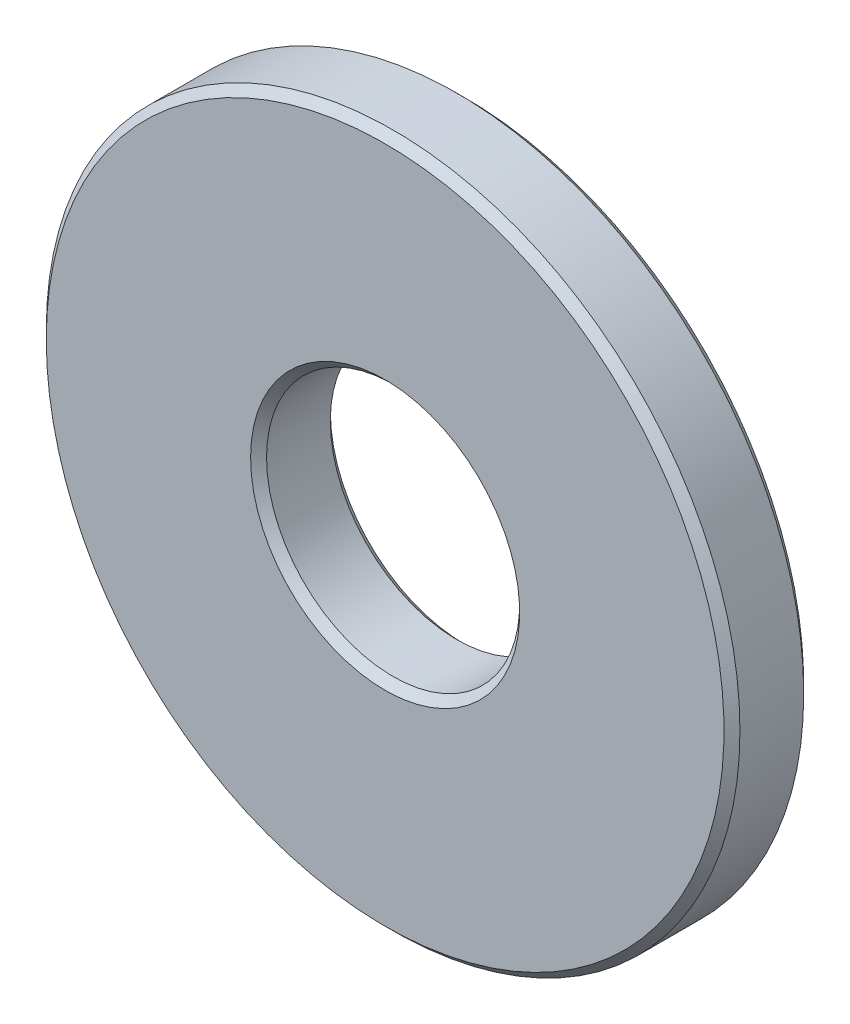
ISO-10303-21;
HEADER;
FILE_DESCRIPTION(('STEP AP214'),'2;1');
FILE_NAME('part.step','',(''),(''),'','','');
FILE_SCHEMA(('AUTOMOTIVE_DESIGN { 1 0 10303 214 1 1 1 1 }'));
ENDSEC;
DATA;
#1=APPLICATION_CONTEXT('core data for automotive mechanical design processes');
#2=APPLICATION_PROTOCOL_DEFINITION('international standard','automotive_design',2000,#1);
#3=PRODUCT_CONTEXT('',#1,'mechanical');
#4=PRODUCT('Part','Part','',(#3));
#5=PRODUCT_RELATED_PRODUCT_CATEGORY('part','',(#4));
#6=PRODUCT_DEFINITION_FORMATION('','',#4);
#7=PRODUCT_DEFINITION_CONTEXT('part definition',#1,'design');
#8=PRODUCT_DEFINITION('design','',#6,#7);
#9=PRODUCT_DEFINITION_SHAPE('','',#8);
#10=(LENGTH_UNIT() NAMED_UNIT(*) SI_UNIT(.MILLI.,.METRE.));
#11=(NAMED_UNIT(*) PLANE_ANGLE_UNIT() SI_UNIT($,.RADIAN.));
#12=(NAMED_UNIT(*) SI_UNIT($,.STERADIAN.) SOLID_ANGLE_UNIT());
#13=UNCERTAINTY_MEASURE_WITH_UNIT(LENGTH_MEASURE(1.E-05),#10,'distance_accuracy_value','');
#14=(GEOMETRIC_REPRESENTATION_CONTEXT(3) GLOBAL_UNCERTAINTY_ASSIGNED_CONTEXT((#13)) GLOBAL_UNIT_ASSIGNED_CONTEXT((#10,
#11,#12)) REPRESENTATION_CONTEXT('',''));
#15=CARTESIAN_POINT('',(0.,0.,0.));
#16=DIRECTION('',(0.,0.,1.));
#17=DIRECTION('',(1.,0.,0.));
#18=AXIS2_PLACEMENT_3D('',#15,#16,#17);
#19=CARTESIAN_POINT('',(86.6025403784436,141.049999999714,354.974757541019));
#20=DIRECTION('',(0.,0.,-1.));
#21=DIRECTION('',(-1.,0.,0.));
#22=AXIS2_PLACEMENT_3D('',#19,#20,#21);
#23=CONICAL_SURFACE('',#22,3.375,0.7853981625);
#24=CARTESIAN_POINT('',(86.6025403784436,141.049999999714,354.974757541019));
#25=DIRECTION('',(0.,0.,-1.));
#26=DIRECTION('',(-1.,0.,0.));
#27=AXIS2_PLACEMENT_3D('',#24,#25,#26);
#28=CIRCLE('',#27,3.375);
#29=CARTESIAN_POINT('',(83.2275403784436,141.049999999714,354.974757541019));
#30=VERTEX_POINT('',#29);
#31=EDGE_CURVE('E81',#30,#30,#28,.T.);
#32=ORIENTED_EDGE('',*,*,#31,.T.);
#33=EDGE_LOOP('',(#32));
#34=FACE_BOUND('',#33,.T.);
#35=CARTESIAN_POINT('',(86.6025403784436,141.049999999714,355.174757541018));
#36=DIRECTION('',(0.,0.,1.));
#37=DIRECTION('',(-1.,0.,0.));
#38=AXIS2_PLACEMENT_3D('',#35,#36,#37);
#39=CIRCLE('',#38,3.175);
#40=CARTESIAN_POINT('',(83.4275403784436,141.049999999714,355.174757541018));
#41=VERTEX_POINT('',#40);
#42=EDGE_CURVE('E88',#41,#41,#39,.T.);
#43=ORIENTED_EDGE('',*,*,#42,.T.);
#44=EDGE_LOOP('',(#43));
#45=FACE_BOUND('',#44,.T.);
#46=ADVANCED_FACE('F43',(#34,#45),#23,.F.);
#47=CARTESIAN_POINT('',(86.6025403784436,141.049999999714,354.974757541019));
#48=DIRECTION('',(0.,0.,1.));
#49=DIRECTION('',(1.,0.,0.));
#50=AXIS2_PLACEMENT_3D('',#47,#48,#49);
#51=CONICAL_SURFACE('',#50,8.5,0.785398162499974);
#52=CARTESIAN_POINT('',(86.6025403784436,141.049999999714,354.974757541019));
#53=DIRECTION('',(0.,0.,1.));
#54=DIRECTION('',(-1.,0.,0.));
#55=AXIS2_PLACEMENT_3D('',#52,#53,#54);
#56=CIRCLE('',#55,8.5);
#57=CARTESIAN_POINT('',(78.1025403784436,141.049999999714,354.974757541019));
#58=VERTEX_POINT('',#57);
#59=EDGE_CURVE('E85',#58,#58,#56,.T.);
#60=ORIENTED_EDGE('',*,*,#59,.T.);
#61=EDGE_LOOP('',(#60));
#62=FACE_BOUND('',#61,.T.);
#63=CARTESIAN_POINT('',(86.6025403784436,141.049999999714,355.174757541018));
#64=DIRECTION('',(0.,0.,-1.));
#65=DIRECTION('',(-1.,0.,0.));
#66=AXIS2_PLACEMENT_3D('',#63,#64,#65);
#67=CIRCLE('',#66,8.7);
#68=CARTESIAN_POINT('',(77.9025403784436,141.049999999714,355.174757541018));
#69=VERTEX_POINT('',#68);
#70=EDGE_CURVE('E75',#69,#69,#67,.T.);
#71=ORIENTED_EDGE('',*,*,#70,.T.);
#72=EDGE_LOOP('',(#71));
#73=FACE_BOUND('',#72,.T.);
#74=ADVANCED_FACE('F86',(#62,#73),#51,.T.);
#75=CARTESIAN_POINT('',(86.6025403784436,141.049999999714,356.774757541019));
#76=DIRECTION('',(0.,0.,1.));
#77=DIRECTION('',(1.,0.,0.));
#78=AXIS2_PLACEMENT_3D('',#75,#76,#77);
#79=CONICAL_SURFACE('',#78,3.175,0.7853981625);
#80=CARTESIAN_POINT('',(86.6025403784436,141.049999999714,356.774757541019));
#81=DIRECTION('',(0.,0.,-1.));
#82=DIRECTION('',(-1.,0.,0.));
#83=AXIS2_PLACEMENT_3D('',#80,#81,#82);
#84=CIRCLE('',#83,3.175);
#85=CARTESIAN_POINT('',(83.4275403784436,141.049999999714,356.774757541019));
#86=VERTEX_POINT('',#85);
#87=EDGE_CURVE('E68',#86,#86,#84,.T.);
#88=ORIENTED_EDGE('',*,*,#87,.T.);
#89=EDGE_LOOP('',(#88));
#90=FACE_BOUND('',#89,.T.);
#91=CARTESIAN_POINT('',(86.6025403784436,141.049999999714,356.974757541019));
#92=DIRECTION('',(0.,0.,1.));
#93=DIRECTION('',(-1.,0.,0.));
#94=AXIS2_PLACEMENT_3D('',#91,#92,#93);
#95=CIRCLE('',#94,3.375);
#96=CARTESIAN_POINT('',(83.2275403784436,141.049999999714,356.974757541019));
#97=VERTEX_POINT('',#96);
#98=EDGE_CURVE('E11',#97,#97,#95,.T.);
#99=ORIENTED_EDGE('',*,*,#98,.T.);
#100=EDGE_LOOP('',(#99));
#101=FACE_BOUND('',#100,.T.);
#102=ADVANCED_FACE('F45',(#90,#101),#79,.F.);
#103=CARTESIAN_POINT('',(86.6025403784436,141.049999999714,356.774757541019));
#104=DIRECTION('',(0.,0.,-1.));
#105=DIRECTION('',(-1.,0.,0.));
#106=AXIS2_PLACEMENT_3D('',#103,#104,#105);
#107=CONICAL_SURFACE('',#106,8.7,0.785398162499974);
#108=CARTESIAN_POINT('',(86.6025403784436,141.049999999714,356.774757541019));
#109=DIRECTION('',(0.,0.,1.));
#110=DIRECTION('',(-1.,0.,0.));
#111=AXIS2_PLACEMENT_3D('',#108,#109,#110);
#112=CIRCLE('',#111,8.7);
#113=CARTESIAN_POINT('',(77.9025403784436,141.049999999714,356.774757541019));
#114=VERTEX_POINT('',#113);
#115=EDGE_CURVE('E95',#114,#114,#112,.T.);
#116=ORIENTED_EDGE('',*,*,#115,.T.);
#117=EDGE_LOOP('',(#116));
#118=FACE_BOUND('',#117,.T.);
#119=CARTESIAN_POINT('',(86.6025403784436,141.049999999714,356.974757541019));
#120=DIRECTION('',(0.,0.,-1.));
#121=DIRECTION('',(-1.,0.,0.));
#122=AXIS2_PLACEMENT_3D('',#119,#120,#121);
#123=CIRCLE('',#122,8.5);
#124=CARTESIAN_POINT('',(78.1025403784436,141.049999999714,356.974757541019));
#125=VERTEX_POINT('',#124);
#126=EDGE_CURVE('E52',#125,#125,#123,.T.);
#127=ORIENTED_EDGE('',*,*,#126,.T.);
#128=EDGE_LOOP('',(#127));
#129=FACE_BOUND('',#128,.T.);
#130=ADVANCED_FACE('F98',(#118,#129),#107,.T.);
#131=CARTESIAN_POINT('',(86.6025403784436,141.049999999714,356.974757541019));
#132=DIRECTION('',(0.,0.,-1.));
#133=DIRECTION('',(0.,-1.,0.));
#134=AXIS2_PLACEMENT_3D('',#131,#132,#133);
#135=PLANE('',#134);
#136=ORIENTED_EDGE('',*,*,#98,.F.);
#137=EDGE_LOOP('',(#136));
#138=FACE_BOUND('',#137,.T.);
#139=ORIENTED_EDGE('',*,*,#126,.F.);
#140=EDGE_LOOP('',(#139));
#141=FACE_BOUND('',#140,.T.);
#142=ADVANCED_FACE('F100',(#138,#141),#135,.F.);
#143=CARTESIAN_POINT('',(86.6025403784436,141.049999999714,354.974757541019));
#144=DIRECTION('',(0.,0.,-1.));
#145=DIRECTION('',(0.,-1.,0.));
#146=AXIS2_PLACEMENT_3D('',#143,#144,#145);
#147=PLANE('',#146);
#148=ORIENTED_EDGE('',*,*,#31,.F.);
#149=EDGE_LOOP('',(#148));
#150=FACE_BOUND('',#149,.T.);
#151=ORIENTED_EDGE('',*,*,#59,.F.);
#152=EDGE_LOOP('',(#151));
#153=FACE_BOUND('',#152,.T.);
#154=ADVANCED_FACE('F102',(#150,#153),#147,.T.);
#155=CARTESIAN_POINT('',(86.6025403784436,141.049999999714,354.974757541019));
#156=DIRECTION('',(0.,0.,1.));
#157=DIRECTION('',(1.,0.,0.));
#158=AXIS2_PLACEMENT_3D('',#155,#156,#157);
#159=CYLINDRICAL_SURFACE('',#158,3.175);
#160=ORIENTED_EDGE('',*,*,#42,.F.);
#161=EDGE_LOOP('',(#160));
#162=FACE_BOUND('',#161,.T.);
#163=ORIENTED_EDGE('',*,*,#87,.F.);
#164=EDGE_LOOP('',(#163));
#165=FACE_BOUND('',#164,.T.);
#166=ADVANCED_FACE('F110',(#162,#165),#159,.F.);
#167=CARTESIAN_POINT('',(86.6025403784436,141.049999999714,354.974757541019));
#168=DIRECTION('',(0.,0.,1.));
#169=DIRECTION('',(1.,0.,0.));
#170=AXIS2_PLACEMENT_3D('',#167,#168,#169);
#171=CYLINDRICAL_SURFACE('',#170,8.7);
#172=ORIENTED_EDGE('',*,*,#70,.F.);
#173=EDGE_LOOP('',(#172));
#174=FACE_BOUND('',#173,.T.);
#175=ORIENTED_EDGE('',*,*,#115,.F.);
#176=EDGE_LOOP('',(#175));
#177=FACE_BOUND('',#176,.T.);
#178=ADVANCED_FACE('F127',(#174,#177),#171,.T.);
#179=CLOSED_SHELL('',(#46,#74,#102,#130,#142,#154,#166,#178));
#180=MANIFOLD_SOLID_BREP('B2',#179);
#181=ADVANCED_BREP_SHAPE_REPRESENTATION('',(#18,#180),#14);
#182=SHAPE_DEFINITION_REPRESENTATION(#9,#181);
ENDSEC;
END-ISO-10303-21;
